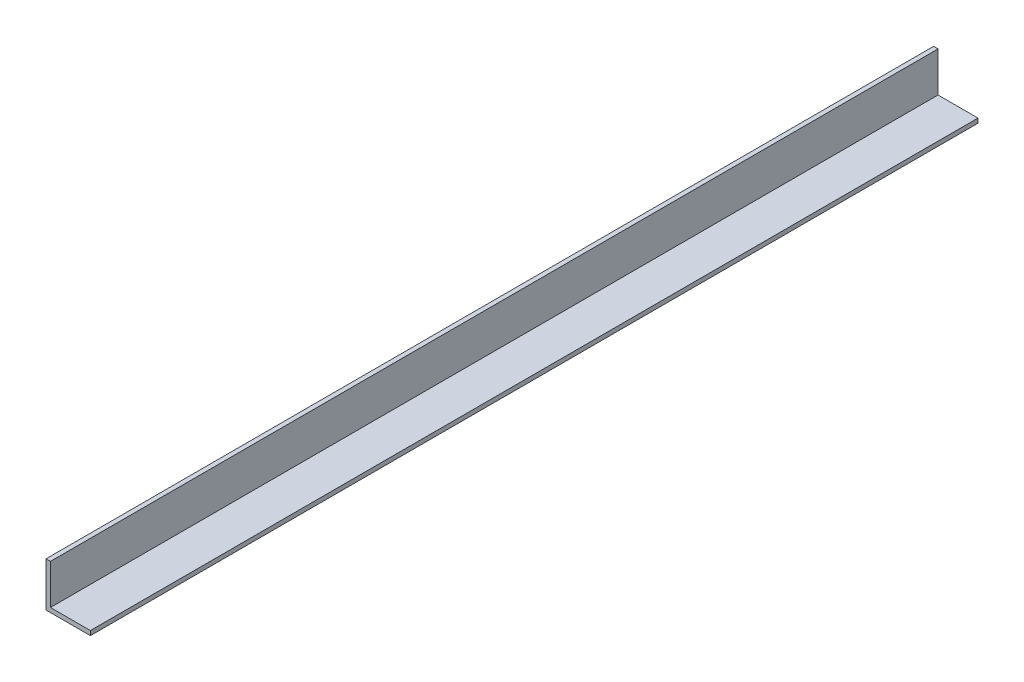
ISO-10303-21;
HEADER;
FILE_DESCRIPTION(('STEP AP214'),'2;1');
FILE_NAME('part.step','',(''),(''),'','','');
FILE_SCHEMA(('AUTOMOTIVE_DESIGN { 1 0 10303 214 1 1 1 1 }'));
ENDSEC;
DATA;
#1=APPLICATION_CONTEXT('core data for automotive mechanical design processes');
#2=APPLICATION_PROTOCOL_DEFINITION('international standard','automotive_design',2000,#1);
#3=PRODUCT_CONTEXT('',#1,'mechanical');
#4=PRODUCT('Part','Part','',(#3));
#5=PRODUCT_RELATED_PRODUCT_CATEGORY('part','',(#4));
#6=PRODUCT_DEFINITION_FORMATION('','',#4);
#7=PRODUCT_DEFINITION_CONTEXT('part definition',#1,'design');
#8=PRODUCT_DEFINITION('design','',#6,#7);
#9=PRODUCT_DEFINITION_SHAPE('','',#8);
#10=(LENGTH_UNIT() NAMED_UNIT(*) SI_UNIT(.MILLI.,.METRE.));
#11=(NAMED_UNIT(*) PLANE_ANGLE_UNIT() SI_UNIT($,.RADIAN.));
#12=(NAMED_UNIT(*) SI_UNIT($,.STERADIAN.) SOLID_ANGLE_UNIT());
#13=UNCERTAINTY_MEASURE_WITH_UNIT(LENGTH_MEASURE(1.E-05),#10,'distance_accuracy_value','');
#14=(GEOMETRIC_REPRESENTATION_CONTEXT(3) GLOBAL_UNCERTAINTY_ASSIGNED_CONTEXT((#13)) GLOBAL_UNIT_ASSIGNED_CONTEXT((#10,
#11,#12)) REPRESENTATION_CONTEXT('',''));
#15=CARTESIAN_POINT('',(0.,0.,0.));
#16=DIRECTION('',(0.,0.,1.));
#17=DIRECTION('',(1.,0.,0.));
#18=AXIS2_PLACEMENT_3D('',#15,#16,#17);
#19=CARTESIAN_POINT('',(0.,15.,300.));
#20=DIRECTION('',(1.,0.,0.));
#21=DIRECTION('',(0.,1.,0.));
#22=AXIS2_PLACEMENT_3D('',#19,#20,#21);
#23=PLANE('',#22);
#24=DIRECTION('',(0.,-1.,0.));
#25=VECTOR('',#24,1.);
#26=CARTESIAN_POINT('',(0.,15.,0.));
#27=LINE('',#26,#25);
#28=CARTESIAN_POINT('',(0.,15.,0.));
#29=VERTEX_POINT('',#28);
#30=CARTESIAN_POINT('',(0.,0.,0.));
#31=VERTEX_POINT('',#30);
#32=EDGE_CURVE('E117',#29,#31,#27,.T.);
#33=ORIENTED_EDGE('',*,*,#32,.T.);
#34=DIRECTION('',(0.,0.,-1.));
#35=VECTOR('',#34,1.);
#36=CARTESIAN_POINT('',(0.,0.,300.));
#37=LINE('',#36,#35);
#38=CARTESIAN_POINT('',(0.,0.,300.));
#39=VERTEX_POINT('',#38);
#40=EDGE_CURVE('E11',#39,#31,#37,.T.);
#41=ORIENTED_EDGE('',*,*,#40,.F.);
#42=DIRECTION('',(0.,-1.,0.));
#43=VECTOR('',#42,1.);
#44=CARTESIAN_POINT('',(0.,15.,300.));
#45=LINE('',#44,#43);
#46=CARTESIAN_POINT('',(0.,15.,300.));
#47=VERTEX_POINT('',#46);
#48=EDGE_CURVE('E127',#47,#39,#45,.T.);
#49=ORIENTED_EDGE('',*,*,#48,.F.);
#50=DIRECTION('',(0.,0.,-1.));
#51=VECTOR('',#50,1.);
#52=CARTESIAN_POINT('',(0.,15.,300.));
#53=LINE('',#52,#51);
#54=EDGE_CURVE('E113',#47,#29,#53,.T.);
#55=ORIENTED_EDGE('',*,*,#54,.T.);
#56=EDGE_LOOP('',(#33,#41,#49,#55));
#57=FACE_BOUND('',#56,.T.);
#58=ADVANCED_FACE('F33',(#57),#23,.F.);
#59=CARTESIAN_POINT('',(0.,0.,300.));
#60=DIRECTION('',(0.,1.,0.));
#61=DIRECTION('',(0.,0.,1.));
#62=AXIS2_PLACEMENT_3D('',#59,#60,#61);
#63=PLANE('',#62);
#64=DIRECTION('',(1.,0.,0.));
#65=VECTOR('',#64,1.);
#66=CARTESIAN_POINT('',(0.,0.,0.));
#67=LINE('',#66,#65);
#68=CARTESIAN_POINT('',(15.,0.,0.));
#69=VERTEX_POINT('',#68);
#70=EDGE_CURVE('E120',#31,#69,#67,.T.);
#71=ORIENTED_EDGE('',*,*,#70,.T.);
#72=DIRECTION('',(0.,0.,-1.));
#73=VECTOR('',#72,1.);
#74=CARTESIAN_POINT('',(15.,0.,300.));
#75=LINE('',#74,#73);
#76=CARTESIAN_POINT('',(15.,0.,300.));
#77=VERTEX_POINT('',#76);
#78=EDGE_CURVE('E41',#77,#69,#75,.T.);
#79=ORIENTED_EDGE('',*,*,#78,.F.);
#80=DIRECTION('',(1.,0.,0.));
#81=VECTOR('',#80,1.);
#82=CARTESIAN_POINT('',(0.,0.,300.));
#83=LINE('',#82,#81);
#84=EDGE_CURVE('E86',#39,#77,#83,.T.);
#85=ORIENTED_EDGE('',*,*,#84,.F.);
#86=ORIENTED_EDGE('',*,*,#40,.T.);
#87=EDGE_LOOP('',(#71,#79,#85,#86));
#88=FACE_BOUND('',#87,.T.);
#89=ADVANCED_FACE('F151',(#88),#63,.F.);
#90=CARTESIAN_POINT('',(15.,0.,300.));
#91=DIRECTION('',(-1.,0.,0.));
#92=DIRECTION('',(0.,0.,1.));
#93=AXIS2_PLACEMENT_3D('',#90,#91,#92);
#94=PLANE('',#93);
#95=DIRECTION('',(0.,1.,0.));
#96=VECTOR('',#95,1.);
#97=CARTESIAN_POINT('',(15.,0.,0.));
#98=LINE('',#97,#96);
#99=CARTESIAN_POINT('',(15.,1.5,0.));
#100=VERTEX_POINT('',#99);
#101=EDGE_CURVE('E122',#69,#100,#98,.T.);
#102=ORIENTED_EDGE('',*,*,#101,.T.);
#103=DIRECTION('',(0.,0.,-1.));
#104=VECTOR('',#103,1.);
#105=CARTESIAN_POINT('',(15.,1.5,300.));
#106=LINE('',#105,#104);
#107=CARTESIAN_POINT('',(15.,1.5,300.));
#108=VERTEX_POINT('',#107);
#109=EDGE_CURVE('E108',#108,#100,#106,.T.);
#110=ORIENTED_EDGE('',*,*,#109,.F.);
#111=DIRECTION('',(0.,1.,0.));
#112=VECTOR('',#111,1.);
#113=CARTESIAN_POINT('',(15.,0.,300.));
#114=LINE('',#113,#112);
#115=EDGE_CURVE('E99',#77,#108,#114,.T.);
#116=ORIENTED_EDGE('',*,*,#115,.F.);
#117=ORIENTED_EDGE('',*,*,#78,.T.);
#118=EDGE_LOOP('',(#102,#110,#116,#117));
#119=FACE_BOUND('',#118,.T.);
#120=ADVANCED_FACE('F133',(#119),#94,.F.);
#121=CARTESIAN_POINT('',(15.,1.5,300.));
#122=DIRECTION('',(0.,-1.,0.));
#123=DIRECTION('',(1.,0.,0.));
#124=AXIS2_PLACEMENT_3D('',#121,#122,#123);
#125=PLANE('',#124);
#126=DIRECTION('',(-1.,0.,0.));
#127=VECTOR('',#126,1.);
#128=CARTESIAN_POINT('',(15.,1.5,0.));
#129=LINE('',#128,#127);
#130=CARTESIAN_POINT('',(1.5,1.5,0.));
#131=VERTEX_POINT('',#130);
#132=EDGE_CURVE('E107',#100,#131,#129,.T.);
#133=ORIENTED_EDGE('',*,*,#132,.T.);
#134=DIRECTION('',(0.,0.,-1.));
#135=VECTOR('',#134,1.);
#136=CARTESIAN_POINT('',(1.5,1.5,300.));
#137=LINE('',#136,#135);
#138=CARTESIAN_POINT('',(1.5,1.5,300.));
#139=VERTEX_POINT('',#138);
#140=EDGE_CURVE('E104',#139,#131,#137,.T.);
#141=ORIENTED_EDGE('',*,*,#140,.F.);
#142=DIRECTION('',(-1.,0.,0.));
#143=VECTOR('',#142,1.);
#144=CARTESIAN_POINT('',(15.,1.5,300.));
#145=LINE('',#144,#143);
#146=EDGE_CURVE('E93',#108,#139,#145,.T.);
#147=ORIENTED_EDGE('',*,*,#146,.F.);
#148=ORIENTED_EDGE('',*,*,#109,.T.);
#149=EDGE_LOOP('',(#133,#141,#147,#148));
#150=FACE_BOUND('',#149,.T.);
#151=ADVANCED_FACE('F105',(#150),#125,.F.);
#152=CARTESIAN_POINT('',(1.5,1.5,300.));
#153=DIRECTION('',(-1.,0.,0.));
#154=DIRECTION('',(0.,0.,1.));
#155=AXIS2_PLACEMENT_3D('',#152,#153,#154);
#156=PLANE('',#155);
#157=DIRECTION('',(0.,1.,0.));
#158=VECTOR('',#157,1.);
#159=CARTESIAN_POINT('',(1.5,1.5,0.));
#160=LINE('',#159,#158);
#161=CARTESIAN_POINT('',(1.5,15.,0.));
#162=VERTEX_POINT('',#161);
#163=EDGE_CURVE('E72',#131,#162,#160,.T.);
#164=ORIENTED_EDGE('',*,*,#163,.T.);
#165=DIRECTION('',(0.,0.,-1.));
#166=VECTOR('',#165,1.);
#167=CARTESIAN_POINT('',(1.5,15.,300.));
#168=LINE('',#167,#166);
#169=CARTESIAN_POINT('',(1.5,15.,300.));
#170=VERTEX_POINT('',#169);
#171=EDGE_CURVE('E109',#170,#162,#168,.T.);
#172=ORIENTED_EDGE('',*,*,#171,.F.);
#173=DIRECTION('',(0.,1.,0.));
#174=VECTOR('',#173,1.);
#175=CARTESIAN_POINT('',(1.5,1.5,300.));
#176=LINE('',#175,#174);
#177=EDGE_CURVE('E97',#139,#170,#176,.T.);
#178=ORIENTED_EDGE('',*,*,#177,.F.);
#179=ORIENTED_EDGE('',*,*,#140,.T.);
#180=EDGE_LOOP('',(#164,#172,#178,#179));
#181=FACE_BOUND('',#180,.T.);
#182=ADVANCED_FACE('F111',(#181),#156,.F.);
#183=CARTESIAN_POINT('',(1.5,15.,300.));
#184=DIRECTION('',(0.,-1.,0.));
#185=DIRECTION('',(0.,0.,-1.));
#186=AXIS2_PLACEMENT_3D('',#183,#184,#185);
#187=PLANE('',#186);
#188=DIRECTION('',(-1.,0.,0.));
#189=VECTOR('',#188,1.);
#190=CARTESIAN_POINT('',(1.5,15.,0.));
#191=LINE('',#190,#189);
#192=EDGE_CURVE('E78',#162,#29,#191,.T.);
#193=ORIENTED_EDGE('',*,*,#192,.T.);
#194=ORIENTED_EDGE('',*,*,#54,.F.);
#195=DIRECTION('',(-1.,0.,0.));
#196=VECTOR('',#195,1.);
#197=CARTESIAN_POINT('',(1.5,15.,300.));
#198=LINE('',#197,#196);
#199=EDGE_CURVE('E49',#170,#47,#198,.T.);
#200=ORIENTED_EDGE('',*,*,#199,.F.);
#201=ORIENTED_EDGE('',*,*,#171,.T.);
#202=EDGE_LOOP('',(#193,#194,#200,#201));
#203=FACE_BOUND('',#202,.T.);
#204=ADVANCED_FACE('F140',(#203),#187,.F.);
#205=CARTESIAN_POINT('',(0.,0.,300.));
#206=DIRECTION('',(0.,0.,1.));
#207=DIRECTION('',(1.,0.,0.));
#208=AXIS2_PLACEMENT_3D('',#205,#206,#207);
#209=PLANE('',#208);
#210=ORIENTED_EDGE('',*,*,#48,.T.);
#211=ORIENTED_EDGE('',*,*,#84,.T.);
#212=ORIENTED_EDGE('',*,*,#115,.T.);
#213=ORIENTED_EDGE('',*,*,#146,.T.);
#214=ORIENTED_EDGE('',*,*,#177,.T.);
#215=ORIENTED_EDGE('',*,*,#199,.T.);
#216=EDGE_LOOP('',(#210,#211,#212,#213,#214,#215));
#217=FACE_BOUND('',#216,.T.);
#218=ADVANCED_FACE('F95',(#217),#209,.T.);
#219=CARTESIAN_POINT('',(0.,0.,0.));
#220=DIRECTION('',(0.,0.,1.));
#221=DIRECTION('',(1.,0.,0.));
#222=AXIS2_PLACEMENT_3D('',#219,#220,#221);
#223=PLANE('',#222);
#224=ORIENTED_EDGE('',*,*,#32,.F.);
#225=ORIENTED_EDGE('',*,*,#192,.F.);
#226=ORIENTED_EDGE('',*,*,#163,.F.);
#227=ORIENTED_EDGE('',*,*,#132,.F.);
#228=ORIENTED_EDGE('',*,*,#101,.F.);
#229=ORIENTED_EDGE('',*,*,#70,.F.);
#230=EDGE_LOOP('',(#224,#225,#226,#227,#228,#229));
#231=FACE_BOUND('',#230,.T.);
#232=ADVANCED_FACE('F136',(#231),#223,.F.);
#233=CLOSED_SHELL('',(#58,#89,#120,#151,#182,#204,#218,#232));
#234=MANIFOLD_SOLID_BREP('B2',#233);
#235=ADVANCED_BREP_SHAPE_REPRESENTATION('',(#18,#234),#14);
#236=SHAPE_DEFINITION_REPRESENTATION(#9,#235);
ENDSEC;
END-ISO-10303-21;
